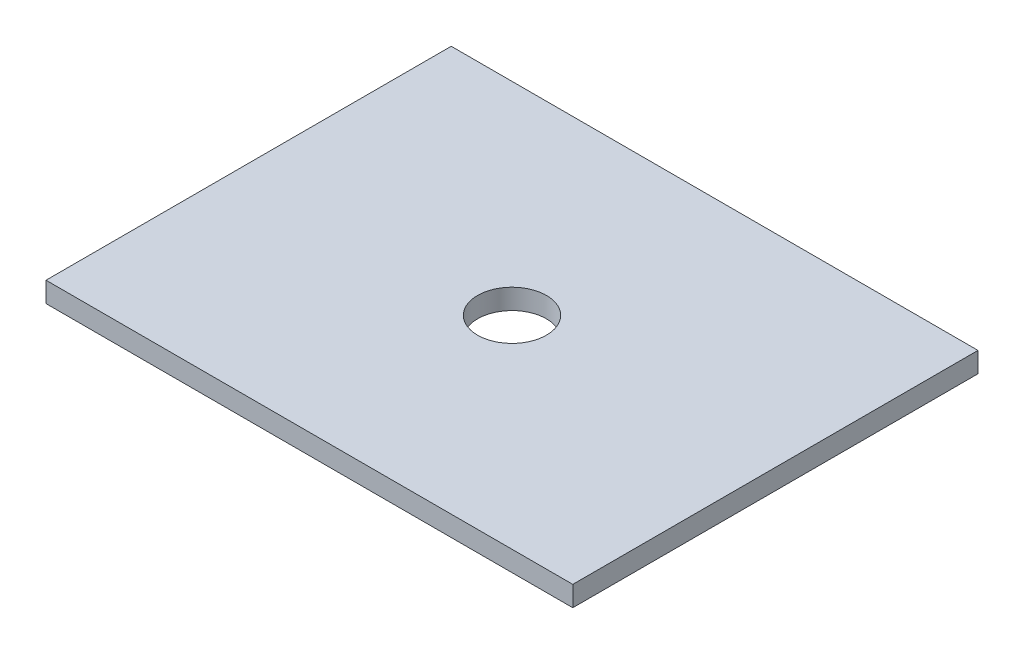
ISO-10303-21;
HEADER;
FILE_DESCRIPTION(('STEP AP214'),'2;1');
FILE_NAME('part.step','',(''),(''),'','','');
FILE_SCHEMA(('AUTOMOTIVE_DESIGN { 1 0 10303 214 1 1 1 1 }'));
ENDSEC;
DATA;
#1=APPLICATION_CONTEXT('core data for automotive mechanical design processes');
#2=APPLICATION_PROTOCOL_DEFINITION('international standard','automotive_design',2000,#1);
#3=PRODUCT_CONTEXT('',#1,'mechanical');
#4=PRODUCT('Part','Part','',(#3));
#5=PRODUCT_RELATED_PRODUCT_CATEGORY('part','',(#4));
#6=PRODUCT_DEFINITION_FORMATION('','',#4);
#7=PRODUCT_DEFINITION_CONTEXT('part definition',#1,'design');
#8=PRODUCT_DEFINITION('design','',#6,#7);
#9=PRODUCT_DEFINITION_SHAPE('','',#8);
#10=(LENGTH_UNIT() NAMED_UNIT(*) SI_UNIT(.MILLI.,.METRE.));
#11=(NAMED_UNIT(*) PLANE_ANGLE_UNIT() SI_UNIT($,.RADIAN.));
#12=(NAMED_UNIT(*) SI_UNIT($,.STERADIAN.) SOLID_ANGLE_UNIT());
#13=UNCERTAINTY_MEASURE_WITH_UNIT(LENGTH_MEASURE(1.E-05),#10,'distance_accuracy_value','');
#14=(GEOMETRIC_REPRESENTATION_CONTEXT(3) GLOBAL_UNCERTAINTY_ASSIGNED_CONTEXT((#13)) GLOBAL_UNIT_ASSIGNED_CONTEXT((#10,
#11,#12)) REPRESENTATION_CONTEXT('',''));
#15=CARTESIAN_POINT('',(0.,0.,0.));
#16=DIRECTION('',(0.,0.,1.));
#17=DIRECTION('',(1.,0.,0.));
#18=AXIS2_PLACEMENT_3D('',#15,#16,#17);
#19=CARTESIAN_POINT('',(-13.,1.,-10.));
#20=DIRECTION('',(1.,0.,0.));
#21=DIRECTION('',(0.,0.,-1.));
#22=AXIS2_PLACEMENT_3D('',#19,#20,#21);
#23=PLANE('',#22);
#24=DIRECTION('',(0.,0.,1.));
#25=VECTOR('',#24,1.);
#26=CARTESIAN_POINT('',(-13.,0.,-10.));
#27=LINE('',#26,#25);
#28=CARTESIAN_POINT('',(-13.,0.,-10.));
#29=VERTEX_POINT('',#28);
#30=CARTESIAN_POINT('',(-13.,0.,10.));
#31=VERTEX_POINT('',#30);
#32=EDGE_CURVE('E106',#29,#31,#27,.T.);
#33=ORIENTED_EDGE('',*,*,#32,.T.);
#34=DIRECTION('',(0.,-1.,0.));
#35=VECTOR('',#34,1.);
#36=CARTESIAN_POINT('',(-13.,1.,10.));
#37=LINE('',#36,#35);
#38=CARTESIAN_POINT('',(-13.,1.,10.));
#39=VERTEX_POINT('',#38);
#40=EDGE_CURVE('E11',#39,#31,#37,.T.);
#41=ORIENTED_EDGE('',*,*,#40,.F.);
#42=DIRECTION('',(0.,0.,1.));
#43=VECTOR('',#42,1.);
#44=CARTESIAN_POINT('',(-13.,1.,-10.));
#45=LINE('',#44,#43);
#46=CARTESIAN_POINT('',(-13.,1.,-10.));
#47=VERTEX_POINT('',#46);
#48=EDGE_CURVE('E94',#47,#39,#45,.T.);
#49=ORIENTED_EDGE('',*,*,#48,.F.);
#50=DIRECTION('',(0.,-1.,0.));
#51=VECTOR('',#50,1.);
#52=CARTESIAN_POINT('',(-13.,1.,-10.));
#53=LINE('',#52,#51);
#54=EDGE_CURVE('E105',#47,#29,#53,.T.);
#55=ORIENTED_EDGE('',*,*,#54,.T.);
#56=EDGE_LOOP('',(#33,#41,#49,#55));
#57=FACE_BOUND('',#56,.T.);
#58=ADVANCED_FACE('F43',(#57),#23,.F.);
#59=CARTESIAN_POINT('',(-13.,1.,10.));
#60=DIRECTION('',(0.,0.,-1.));
#61=DIRECTION('',(-1.,0.,0.));
#62=AXIS2_PLACEMENT_3D('',#59,#60,#61);
#63=PLANE('',#62);
#64=DIRECTION('',(1.,0.,0.));
#65=VECTOR('',#64,1.);
#66=CARTESIAN_POINT('',(-13.,0.,10.));
#67=LINE('',#66,#65);
#68=CARTESIAN_POINT('',(13.,0.,10.));
#69=VERTEX_POINT('',#68);
#70=EDGE_CURVE('E98',#31,#69,#67,.T.);
#71=ORIENTED_EDGE('',*,*,#70,.T.);
#72=DIRECTION('',(0.,-1.,0.));
#73=VECTOR('',#72,1.);
#74=CARTESIAN_POINT('',(13.,1.,10.));
#75=LINE('',#74,#73);
#76=CARTESIAN_POINT('',(13.,1.,10.));
#77=VERTEX_POINT('',#76);
#78=EDGE_CURVE('E51',#77,#69,#75,.T.);
#79=ORIENTED_EDGE('',*,*,#78,.F.);
#80=DIRECTION('',(1.,0.,0.));
#81=VECTOR('',#80,1.);
#82=CARTESIAN_POINT('',(-13.,1.,10.));
#83=LINE('',#82,#81);
#84=EDGE_CURVE('E90',#39,#77,#83,.T.);
#85=ORIENTED_EDGE('',*,*,#84,.F.);
#86=ORIENTED_EDGE('',*,*,#40,.T.);
#87=EDGE_LOOP('',(#71,#79,#85,#86));
#88=FACE_BOUND('',#87,.T.);
#89=ADVANCED_FACE('F100',(#88),#63,.F.);
#90=CARTESIAN_POINT('',(13.,1.,-10.));
#91=DIRECTION('',(-1.,0.,0.));
#92=DIRECTION('',(0.,0.,1.));
#93=AXIS2_PLACEMENT_3D('',#90,#91,#92);
#94=PLANE('',#93);
#95=DIRECTION('',(0.,0.,-1.));
#96=VECTOR('',#95,1.);
#97=CARTESIAN_POINT('',(13.,0.,-10.));
#98=LINE('',#97,#96);
#99=CARTESIAN_POINT('',(13.,0.,-10.));
#100=VERTEX_POINT('',#99);
#101=EDGE_CURVE('E78',#69,#100,#98,.T.);
#102=ORIENTED_EDGE('',*,*,#101,.T.);
#103=DIRECTION('',(0.,-1.,0.));
#104=VECTOR('',#103,1.);
#105=CARTESIAN_POINT('',(13.,1.,-10.));
#106=LINE('',#105,#104);
#107=CARTESIAN_POINT('',(13.,1.,-10.));
#108=VERTEX_POINT('',#107);
#109=EDGE_CURVE('E97',#108,#100,#106,.T.);
#110=ORIENTED_EDGE('',*,*,#109,.F.);
#111=DIRECTION('',(0.,0.,-1.));
#112=VECTOR('',#111,1.);
#113=CARTESIAN_POINT('',(13.,1.,-10.));
#114=LINE('',#113,#112);
#115=EDGE_CURVE('E95',#77,#108,#114,.T.);
#116=ORIENTED_EDGE('',*,*,#115,.F.);
#117=ORIENTED_EDGE('',*,*,#78,.T.);
#118=EDGE_LOOP('',(#102,#110,#116,#117));
#119=FACE_BOUND('',#118,.T.);
#120=ADVANCED_FACE('F99',(#119),#94,.F.);
#121=CARTESIAN_POINT('',(-13.,1.,-10.));
#122=DIRECTION('',(0.,0.,1.));
#123=DIRECTION('',(1.,0.,0.));
#124=AXIS2_PLACEMENT_3D('',#121,#122,#123);
#125=PLANE('',#124);
#126=DIRECTION('',(-1.,0.,0.));
#127=VECTOR('',#126,1.);
#128=CARTESIAN_POINT('',(-13.,0.,-10.));
#129=LINE('',#128,#127);
#130=EDGE_CURVE('E85',#100,#29,#129,.T.);
#131=ORIENTED_EDGE('',*,*,#130,.T.);
#132=ORIENTED_EDGE('',*,*,#54,.F.);
#133=DIRECTION('',(-1.,0.,0.));
#134=VECTOR('',#133,1.);
#135=CARTESIAN_POINT('',(-13.,1.,-10.));
#136=LINE('',#135,#134);
#137=EDGE_CURVE('E56',#108,#47,#136,.T.);
#138=ORIENTED_EDGE('',*,*,#137,.F.);
#139=ORIENTED_EDGE('',*,*,#109,.T.);
#140=EDGE_LOOP('',(#131,#132,#138,#139));
#141=FACE_BOUND('',#140,.T.);
#142=ADVANCED_FACE('F111',(#141),#125,.F.);
#143=CARTESIAN_POINT('',(0.,1.,0.));
#144=DIRECTION('',(0.,1.,0.));
#145=DIRECTION('',(0.,0.,1.));
#146=AXIS2_PLACEMENT_3D('',#143,#144,#145);
#147=PLANE('',#146);
#148=CARTESIAN_POINT('',(0.,1.,0.));
#149=DIRECTION('',(0.,1.,0.));
#150=DIRECTION('',(0.,0.,1.));
#151=AXIS2_PLACEMENT_3D('',#148,#149,#150);
#152=CIRCLE('',#151,1.7);
#153=CARTESIAN_POINT('',(0.,1.,1.7));
#154=VERTEX_POINT('',#153);
#155=EDGE_CURVE('E108',#154,#154,#152,.T.);
#156=ORIENTED_EDGE('',*,*,#155,.F.);
#157=EDGE_LOOP('',(#156));
#158=FACE_BOUND('',#157,.T.);
#159=ORIENTED_EDGE('',*,*,#48,.T.);
#160=ORIENTED_EDGE('',*,*,#84,.T.);
#161=ORIENTED_EDGE('',*,*,#115,.T.);
#162=ORIENTED_EDGE('',*,*,#137,.T.);
#163=EDGE_LOOP('',(#159,#160,#161,#162));
#164=FACE_BOUND('',#163,.T.);
#165=ADVANCED_FACE('F89',(#158,#164),#147,.T.);
#166=CARTESIAN_POINT('',(0.,0.,0.));
#167=DIRECTION('',(0.,1.,0.));
#168=DIRECTION('',(0.,0.,1.));
#169=AXIS2_PLACEMENT_3D('',#166,#167,#168);
#170=PLANE('',#169);
#171=CARTESIAN_POINT('',(0.,0.,0.));
#172=DIRECTION('',(0.,1.,0.));
#173=DIRECTION('',(0.,0.,1.));
#174=AXIS2_PLACEMENT_3D('',#171,#172,#173);
#175=CIRCLE('',#174,1.7);
#176=CARTESIAN_POINT('',(0.,0.,1.7));
#177=VERTEX_POINT('',#176);
#178=EDGE_CURVE('E117',#177,#177,#175,.T.);
#179=ORIENTED_EDGE('',*,*,#178,.T.);
#180=EDGE_LOOP('',(#179));
#181=FACE_BOUND('',#180,.T.);
#182=ORIENTED_EDGE('',*,*,#32,.F.);
#183=ORIENTED_EDGE('',*,*,#130,.F.);
#184=ORIENTED_EDGE('',*,*,#101,.F.);
#185=ORIENTED_EDGE('',*,*,#70,.F.);
#186=EDGE_LOOP('',(#182,#183,#184,#185));
#187=FACE_BOUND('',#186,.T.);
#188=ADVANCED_FACE('F120',(#181,#187),#170,.F.);
#189=CARTESIAN_POINT('',(0.,1.,0.));
#190=DIRECTION('',(0.,-1.,0.));
#191=DIRECTION('',(0.,0.,-1.));
#192=AXIS2_PLACEMENT_3D('',#189,#190,#191);
#193=CYLINDRICAL_SURFACE('',#192,1.7);
#194=ORIENTED_EDGE('',*,*,#155,.T.);
#195=EDGE_LOOP('',(#194));
#196=FACE_BOUND('',#195,.T.);
#197=ORIENTED_EDGE('',*,*,#178,.F.);
#198=EDGE_LOOP('',(#197));
#199=FACE_BOUND('',#198,.T.);
#200=ADVANCED_FACE('F127',(#196,#199),#193,.F.);
#201=CLOSED_SHELL('',(#58,#89,#120,#142,#165,#188,#200));
#202=MANIFOLD_SOLID_BREP('B2',#201);
#203=ADVANCED_BREP_SHAPE_REPRESENTATION('',(#18,#202),#14);
#204=SHAPE_DEFINITION_REPRESENTATION(#9,#203);
ENDSEC;
END-ISO-10303-21;
